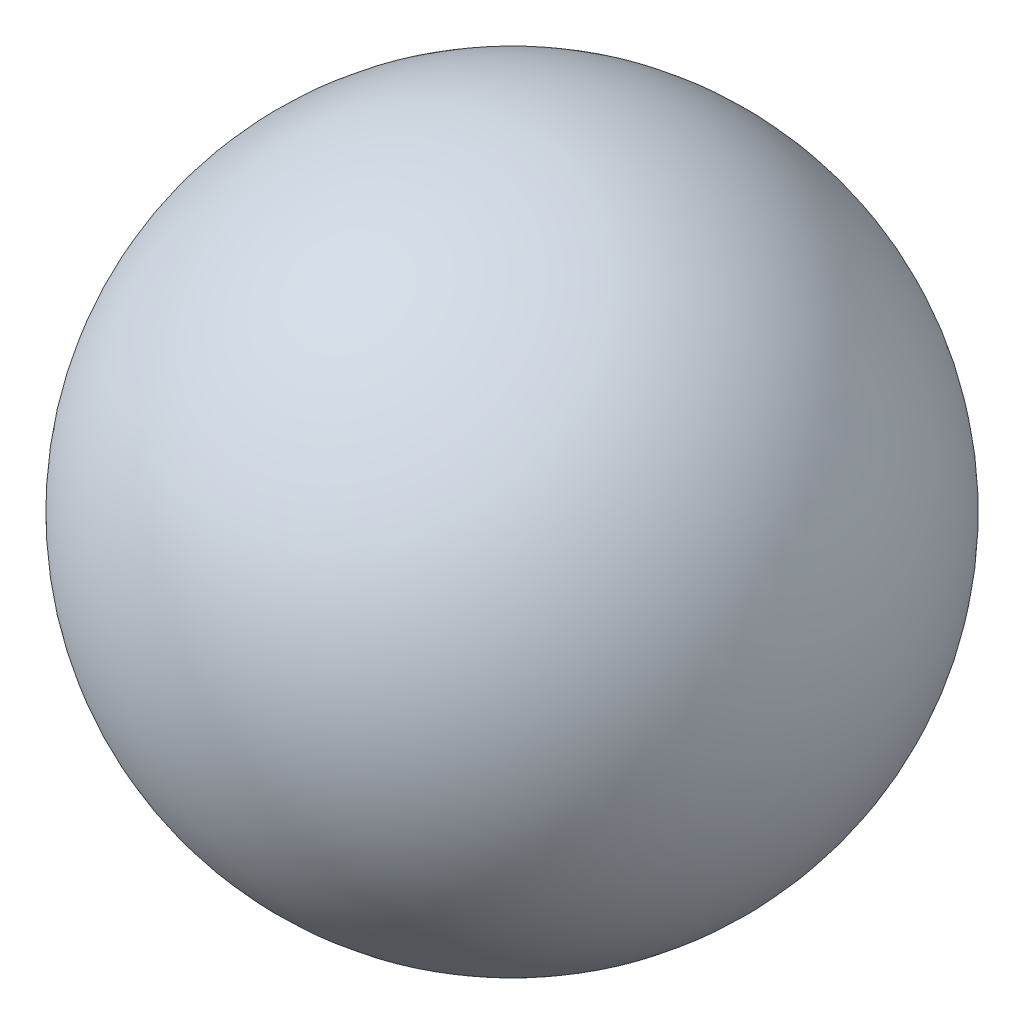
ISO-10303-21;
HEADER;
FILE_DESCRIPTION(('STEP AP214'),'2;1');
FILE_NAME('part.step','',(''),(''),'','','');
FILE_SCHEMA(('AUTOMOTIVE_DESIGN { 1 0 10303 214 1 1 1 1 }'));
ENDSEC;
DATA;
#1=APPLICATION_CONTEXT('core data for automotive mechanical design processes');
#2=APPLICATION_PROTOCOL_DEFINITION('international standard','automotive_design',2000,#1);
#3=PRODUCT_CONTEXT('',#1,'mechanical');
#4=PRODUCT('Part','Part','',(#3));
#5=PRODUCT_RELATED_PRODUCT_CATEGORY('part','',(#4));
#6=PRODUCT_DEFINITION_FORMATION('','',#4);
#7=PRODUCT_DEFINITION_CONTEXT('part definition',#1,'design');
#8=PRODUCT_DEFINITION('design','',#6,#7);
#9=PRODUCT_DEFINITION_SHAPE('','',#8);
#10=(LENGTH_UNIT() NAMED_UNIT(*) SI_UNIT(.MILLI.,.METRE.));
#11=(NAMED_UNIT(*) PLANE_ANGLE_UNIT() SI_UNIT($,.RADIAN.));
#12=(NAMED_UNIT(*) SI_UNIT($,.STERADIAN.) SOLID_ANGLE_UNIT());
#13=UNCERTAINTY_MEASURE_WITH_UNIT(LENGTH_MEASURE(1.E-05),#10,'distance_accuracy_value','');
#14=(GEOMETRIC_REPRESENTATION_CONTEXT(3) GLOBAL_UNCERTAINTY_ASSIGNED_CONTEXT((#13)) GLOBAL_UNIT_ASSIGNED_CONTEXT((#10,
#11,#12)) REPRESENTATION_CONTEXT('',''));
#15=CARTESIAN_POINT('',(0.,0.,0.));
#16=DIRECTION('',(0.,0.,1.));
#17=DIRECTION('',(1.,0.,0.));
#18=AXIS2_PLACEMENT_3D('',#15,#16,#17);
#19=CARTESIAN_POINT('',(0.,0.,0.));
#20=DIRECTION('',(0.,1.,0.));
#21=DIRECTION('',(1.,0.,0.));
#22=AXIS2_PLACEMENT_3D('',#19,#20,#21);
#23=SPHERICAL_SURFACE('',#22,2.778125);
#24=CARTESIAN_POINT('',(0.,2.778125,0.));
#25=VERTEX_POINT('',#24);
#26=VERTEX_LOOP('',#25);
#27=FACE_BOUND('',#26,.T.);
#28=ADVANCED_FACE('F29',(#27),#23,.T.);
#29=CLOSED_SHELL('',(#28));
#30=MANIFOLD_SOLID_BREP('B2',#29);
#31=ADVANCED_BREP_SHAPE_REPRESENTATION('',(#18,#30),#14);
#32=SHAPE_DEFINITION_REPRESENTATION(#9,#31);
ENDSEC;
END-ISO-10303-21;
